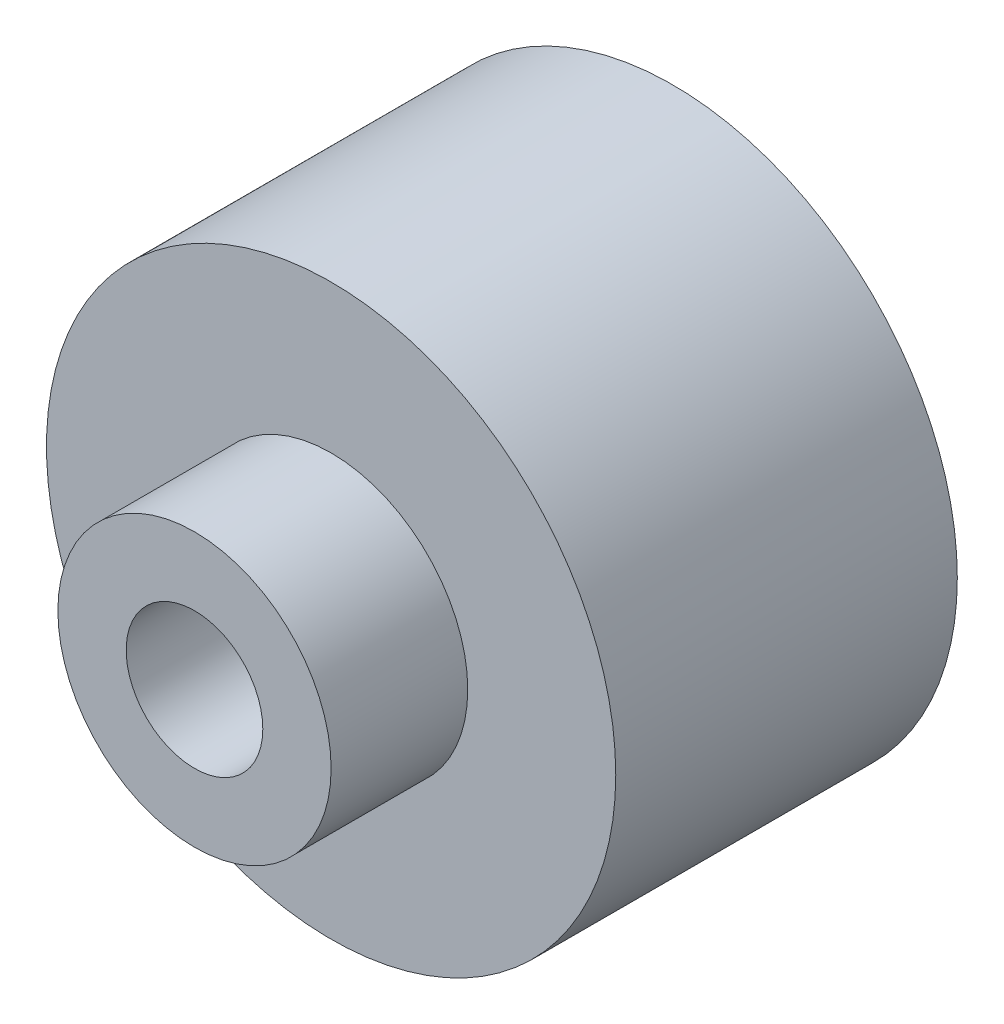
ISO-10303-21;
HEADER;
FILE_DESCRIPTION(('STEP AP214'),'2;1');
FILE_NAME('part.step','',(''),(''),'','','');
FILE_SCHEMA(('AUTOMOTIVE_DESIGN { 1 0 10303 214 1 1 1 1 }'));
ENDSEC;
DATA;
#1=APPLICATION_CONTEXT('core data for automotive mechanical design processes');
#2=APPLICATION_PROTOCOL_DEFINITION('international standard','automotive_design',2000,#1);
#3=PRODUCT_CONTEXT('',#1,'mechanical');
#4=PRODUCT('Part','Part','',(#3));
#5=PRODUCT_RELATED_PRODUCT_CATEGORY('part','',(#4));
#6=PRODUCT_DEFINITION_FORMATION('','',#4);
#7=PRODUCT_DEFINITION_CONTEXT('part definition',#1,'design');
#8=PRODUCT_DEFINITION('design','',#6,#7);
#9=PRODUCT_DEFINITION_SHAPE('','',#8);
#10=(LENGTH_UNIT() NAMED_UNIT(*) SI_UNIT(.MILLI.,.METRE.));
#11=(NAMED_UNIT(*) PLANE_ANGLE_UNIT() SI_UNIT($,.RADIAN.));
#12=(NAMED_UNIT(*) SI_UNIT($,.STERADIAN.) SOLID_ANGLE_UNIT());
#13=UNCERTAINTY_MEASURE_WITH_UNIT(LENGTH_MEASURE(1.E-05),#10,'distance_accuracy_value','');
#14=(GEOMETRIC_REPRESENTATION_CONTEXT(3) GLOBAL_UNCERTAINTY_ASSIGNED_CONTEXT((#13)) GLOBAL_UNIT_ASSIGNED_CONTEXT((#10,
#11,#12)) REPRESENTATION_CONTEXT('',''));
#15=CARTESIAN_POINT('',(0.,0.,0.));
#16=DIRECTION('',(0.,0.,1.));
#17=DIRECTION('',(1.,0.,0.));
#18=AXIS2_PLACEMENT_3D('',#15,#16,#17);
#19=CARTESIAN_POINT('',(12.5,0.,0.));
#20=DIRECTION('',(0.,0.,-1.));
#21=DIRECTION('',(-1.,0.,0.));
#22=AXIS2_PLACEMENT_3D('',#19,#20,#21);
#23=PLANE('',#22);
#24=CARTESIAN_POINT('',(0.,0.,0.));
#25=DIRECTION('',(0.,0.,1.));
#26=DIRECTION('',(1.,0.,0.));
#27=AXIS2_PLACEMENT_3D('',#24,#25,#26);
#28=CIRCLE('',#27,3.);
#29=CARTESIAN_POINT('',(3.,0.,0.));
#30=VERTEX_POINT('',#29);
#31=EDGE_CURVE('E10',#30,#30,#28,.T.);
#32=ORIENTED_EDGE('',*,*,#31,.T.);
#33=EDGE_LOOP('',(#32));
#34=FACE_BOUND('',#33,.T.);
#35=CARTESIAN_POINT('',(0.,0.,0.));
#36=DIRECTION('',(0.,0.,1.));
#37=DIRECTION('',(1.,0.,0.));
#38=AXIS2_PLACEMENT_3D('',#35,#36,#37);
#39=CIRCLE('',#38,12.5);
#40=CARTESIAN_POINT('',(12.5,0.,0.));
#41=VERTEX_POINT('',#40);
#42=EDGE_CURVE('E55',#41,#41,#39,.T.);
#43=ORIENTED_EDGE('',*,*,#42,.F.);
#44=EDGE_LOOP('',(#43));
#45=FACE_BOUND('',#44,.T.);
#46=ADVANCED_FACE('F33',(#34,#45),#23,.T.);
#47=CARTESIAN_POINT('',(0.,0.,0.));
#48=DIRECTION('',(0.,0.,1.));
#49=DIRECTION('',(1.,0.,0.));
#50=AXIS2_PLACEMENT_3D('',#47,#48,#49);
#51=CYLINDRICAL_SURFACE('',#50,3.);
#52=CARTESIAN_POINT('',(0.,0.,21.));
#53=DIRECTION('',(0.,0.,1.));
#54=DIRECTION('',(1.,0.,0.));
#55=AXIS2_PLACEMENT_3D('',#52,#53,#54);
#56=CIRCLE('',#55,3.);
#57=CARTESIAN_POINT('',(3.,0.,21.));
#58=VERTEX_POINT('',#57);
#59=EDGE_CURVE('E39',#58,#58,#56,.T.);
#60=ORIENTED_EDGE('',*,*,#59,.T.);
#61=EDGE_LOOP('',(#60));
#62=FACE_BOUND('',#61,.T.);
#63=ORIENTED_EDGE('',*,*,#31,.F.);
#64=EDGE_LOOP('',(#63));
#65=FACE_BOUND('',#64,.T.);
#66=ADVANCED_FACE('F63',(#62,#65),#51,.F.);
#67=CARTESIAN_POINT('',(3.,0.,21.));
#68=DIRECTION('',(0.,0.,1.));
#69=DIRECTION('',(1.,0.,0.));
#70=AXIS2_PLACEMENT_3D('',#67,#68,#69);
#71=PLANE('',#70);
#72=CARTESIAN_POINT('',(0.,0.,21.));
#73=DIRECTION('',(0.,0.,1.));
#74=DIRECTION('',(1.,0.,0.));
#75=AXIS2_PLACEMENT_3D('',#72,#73,#74);
#76=CIRCLE('',#75,6.);
#77=CARTESIAN_POINT('',(6.,0.,21.));
#78=VERTEX_POINT('',#77);
#79=EDGE_CURVE('E43',#78,#78,#76,.T.);
#80=ORIENTED_EDGE('',*,*,#79,.T.);
#81=EDGE_LOOP('',(#80));
#82=FACE_BOUND('',#81,.T.);
#83=ORIENTED_EDGE('',*,*,#59,.F.);
#84=EDGE_LOOP('',(#83));
#85=FACE_BOUND('',#84,.T.);
#86=ADVANCED_FACE('F67',(#82,#85),#71,.T.);
#87=CARTESIAN_POINT('',(0.,0.,0.));
#88=DIRECTION('',(0.,0.,1.));
#89=DIRECTION('',(1.,0.,0.));
#90=AXIS2_PLACEMENT_3D('',#87,#88,#89);
#91=CYLINDRICAL_SURFACE('',#90,6.);
#92=CARTESIAN_POINT('',(0.,0.,15.));
#93=DIRECTION('',(0.,0.,1.));
#94=DIRECTION('',(1.,0.,0.));
#95=AXIS2_PLACEMENT_3D('',#92,#93,#94);
#96=CIRCLE('',#95,6.);
#97=CARTESIAN_POINT('',(6.,0.,15.));
#98=VERTEX_POINT('',#97);
#99=EDGE_CURVE('E47',#98,#98,#96,.T.);
#100=ORIENTED_EDGE('',*,*,#99,.T.);
#101=EDGE_LOOP('',(#100));
#102=FACE_BOUND('',#101,.T.);
#103=ORIENTED_EDGE('',*,*,#79,.F.);
#104=EDGE_LOOP('',(#103));
#105=FACE_BOUND('',#104,.T.);
#106=ADVANCED_FACE('F71',(#102,#105),#91,.T.);
#107=CARTESIAN_POINT('',(6.,0.,15.));
#108=DIRECTION('',(0.,0.,1.));
#109=DIRECTION('',(1.,0.,0.));
#110=AXIS2_PLACEMENT_3D('',#107,#108,#109);
#111=PLANE('',#110);
#112=CARTESIAN_POINT('',(0.,0.,15.));
#113=DIRECTION('',(0.,0.,1.));
#114=DIRECTION('',(1.,0.,0.));
#115=AXIS2_PLACEMENT_3D('',#112,#113,#114);
#116=CIRCLE('',#115,12.5);
#117=CARTESIAN_POINT('',(12.5,0.,15.));
#118=VERTEX_POINT('',#117);
#119=EDGE_CURVE('E52',#118,#118,#116,.T.);
#120=ORIENTED_EDGE('',*,*,#119,.T.);
#121=EDGE_LOOP('',(#120));
#122=FACE_BOUND('',#121,.T.);
#123=ORIENTED_EDGE('',*,*,#99,.F.);
#124=EDGE_LOOP('',(#123));
#125=FACE_BOUND('',#124,.T.);
#126=ADVANCED_FACE('F78',(#122,#125),#111,.T.);
#127=CARTESIAN_POINT('',(0.,0.,0.));
#128=DIRECTION('',(0.,0.,1.));
#129=DIRECTION('',(1.,0.,0.));
#130=AXIS2_PLACEMENT_3D('',#127,#128,#129);
#131=CYLINDRICAL_SURFACE('',#130,12.5);
#132=ORIENTED_EDGE('',*,*,#42,.T.);
#133=EDGE_LOOP('',(#132));
#134=FACE_BOUND('',#133,.T.);
#135=ORIENTED_EDGE('',*,*,#119,.F.);
#136=EDGE_LOOP('',(#135));
#137=FACE_BOUND('',#136,.T.);
#138=ADVANCED_FACE('F59',(#134,#137),#131,.T.);
#139=CLOSED_SHELL('',(#46,#66,#86,#106,#126,#138));
#140=MANIFOLD_SOLID_BREP('B2',#139);
#141=ADVANCED_BREP_SHAPE_REPRESENTATION('',(#18,#140),#14);
#142=SHAPE_DEFINITION_REPRESENTATION(#9,#141);
ENDSEC;
END-ISO-10303-21;
